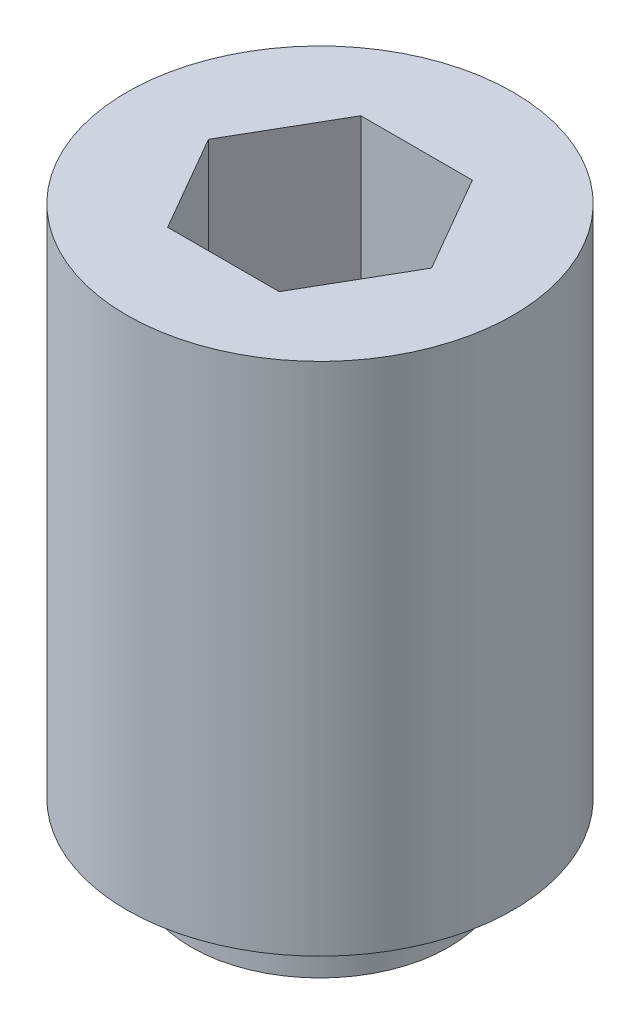
ISO-10303-21;
HEADER;
FILE_DESCRIPTION(('STEP AP214'),'2;1');
FILE_NAME('part.step','',(''),(''),'','','');
FILE_SCHEMA(('AUTOMOTIVE_DESIGN { 1 0 10303 214 1 1 1 1 }'));
ENDSEC;
DATA;
#1=APPLICATION_CONTEXT('core data for automotive mechanical design processes');
#2=APPLICATION_PROTOCOL_DEFINITION('international standard','automotive_design',2000,#1);
#3=PRODUCT_CONTEXT('',#1,'mechanical');
#4=PRODUCT('Part','Part','',(#3));
#5=PRODUCT_RELATED_PRODUCT_CATEGORY('part','',(#4));
#6=PRODUCT_DEFINITION_FORMATION('','',#4);
#7=PRODUCT_DEFINITION_CONTEXT('part definition',#1,'design');
#8=PRODUCT_DEFINITION('design','',#6,#7);
#9=PRODUCT_DEFINITION_SHAPE('','',#8);
#10=(LENGTH_UNIT() NAMED_UNIT(*) SI_UNIT(.MILLI.,.METRE.));
#11=(NAMED_UNIT(*) PLANE_ANGLE_UNIT() SI_UNIT($,.RADIAN.));
#12=(NAMED_UNIT(*) SI_UNIT($,.STERADIAN.) SOLID_ANGLE_UNIT());
#13=UNCERTAINTY_MEASURE_WITH_UNIT(LENGTH_MEASURE(1.E-05),#10,'distance_accuracy_value','');
#14=(GEOMETRIC_REPRESENTATION_CONTEXT(3) GLOBAL_UNCERTAINTY_ASSIGNED_CONTEXT((#13)) GLOBAL_UNIT_ASSIGNED_CONTEXT((#10,
#11,#12)) REPRESENTATION_CONTEXT('',''));
#15=CARTESIAN_POINT('',(0.,0.,0.));
#16=DIRECTION('',(0.,0.,1.));
#17=DIRECTION('',(1.,0.,0.));
#18=AXIS2_PLACEMENT_3D('',#15,#16,#17);
#19=CARTESIAN_POINT('',(0.,-9.,0.));
#20=DIRECTION('',(0.,1.,0.));
#21=DIRECTION('',(0.,0.,1.));
#22=AXIS2_PLACEMENT_3D('',#19,#20,#21);
#23=CYLINDRICAL_SURFACE('',#22,2.);
#24=CARTESIAN_POINT('',(0.,-9.,0.));
#25=DIRECTION('',(0.,-1.,0.));
#26=DIRECTION('',(0.,0.,-1.));
#27=AXIS2_PLACEMENT_3D('',#24,#25,#26);
#28=CIRCLE('',#27,2.);
#29=CARTESIAN_POINT('',(0.,-9.,-2.));
#30=VERTEX_POINT('',#29);
#31=EDGE_CURVE('E11',#30,#30,#28,.T.);
#32=ORIENTED_EDGE('',*,*,#31,.F.);
#33=EDGE_LOOP('',(#32));
#34=FACE_BOUND('',#33,.T.);
#35=CARTESIAN_POINT('',(0.,-8.,0.));
#36=DIRECTION('',(0.,-1.,0.));
#37=DIRECTION('',(0.,0.,-1.));
#38=AXIS2_PLACEMENT_3D('',#35,#36,#37);
#39=CIRCLE('',#38,2.);
#40=CARTESIAN_POINT('',(0.,-8.,-2.));
#41=VERTEX_POINT('',#40);
#42=EDGE_CURVE('E47',#41,#41,#39,.T.);
#43=ORIENTED_EDGE('',*,*,#42,.T.);
#44=EDGE_LOOP('',(#43));
#45=FACE_BOUND('',#44,.T.);
#46=ADVANCED_FACE('F44',(#34,#45),#23,.T.);
#47=CARTESIAN_POINT('',(0.,-9.,0.));
#48=DIRECTION('',(0.,-1.,0.));
#49=DIRECTION('',(0.,0.,-1.));
#50=AXIS2_PLACEMENT_3D('',#47,#48,#49);
#51=PLANE('',#50);
#52=ORIENTED_EDGE('',*,*,#31,.T.);
#53=EDGE_LOOP('',(#52));
#54=FACE_BOUND('',#53,.T.);
#55=ADVANCED_FACE('F59',(#54),#51,.T.);
#56=CARTESIAN_POINT('',(0.,-8.,0.));
#57=DIRECTION('',(0.,-1.,0.));
#58=DIRECTION('',(0.,0.,-1.));
#59=AXIS2_PLACEMENT_3D('',#56,#57,#58);
#60=PLANE('',#59);
#61=ORIENTED_EDGE('',*,*,#42,.F.);
#62=EDGE_LOOP('',(#61));
#63=FACE_BOUND('',#62,.T.);
#64=ADVANCED_FACE('F57',(#63),#60,.F.);
#65=CLOSED_SHELL('',(#46,#55,#64));
#66=MANIFOLD_SOLID_BREP('B2',#65);
#67=CARTESIAN_POINT('',(0.,-8.,0.));
#68=DIRECTION('',(0.,1.,0.));
#69=DIRECTION('',(0.,0.,1.));
#70=AXIS2_PLACEMENT_3D('',#67,#68,#69);
#71=PLANE('',#70);
#72=CARTESIAN_POINT('',(0.,-7.99999999999999,0.));
#73=DIRECTION('',(0.,1.,0.));
#74=DIRECTION('',(0.,0.,1.));
#75=AXIS2_PLACEMENT_3D('',#72,#73,#74);
#76=CIRCLE('',#75,3.00000000000001);
#77=CARTESIAN_POINT('',(0.,-7.99999999999999,3.00000000000001));
#78=VERTEX_POINT('',#77);
#79=EDGE_CURVE('E42',#78,#78,#76,.T.);
#80=ORIENTED_EDGE('',*,*,#79,.F.);
#81=EDGE_LOOP('',(#80));
#82=FACE_BOUND('',#81,.T.);
#83=ADVANCED_FACE('F84',(#82),#71,.F.);
#84=CARTESIAN_POINT('',(0.,61.6916426261037,0.));
#85=DIRECTION('',(0.,1.,0.));
#86=DIRECTION('',(0.,0.,1.));
#87=AXIS2_PLACEMENT_3D('',#84,#85,#86);
#88=CYLINDRICAL_SURFACE('',#87,3.00000000000001);
#89=CARTESIAN_POINT('',(0.,0.,0.));
#90=DIRECTION('',(0.,1.,0.));
#91=DIRECTION('',(0.,0.,1.));
#92=AXIS2_PLACEMENT_3D('',#89,#90,#91);
#93=CIRCLE('',#92,3.00000000000001);
#94=CARTESIAN_POINT('',(0.,0.,3.00000000000001));
#95=VERTEX_POINT('',#94);
#96=EDGE_CURVE('E91',#95,#95,#93,.T.);
#97=ORIENTED_EDGE('',*,*,#96,.F.);
#98=EDGE_LOOP('',(#97));
#99=FACE_BOUND('',#98,.T.);
#100=ORIENTED_EDGE('',*,*,#79,.T.);
#101=EDGE_LOOP('',(#100));
#102=FACE_BOUND('',#101,.T.);
#103=ADVANCED_FACE('F194',(#99,#102),#88,.T.);
#104=CARTESIAN_POINT('',(3.00000000000001,0.,0.));
#105=DIRECTION('',(0.,-1.,0.));
#106=DIRECTION('',(0.,0.,-1.));
#107=AXIS2_PLACEMENT_3D('',#104,#105,#106);
#108=PLANE('',#107);
#109=DIRECTION('',(-1.,0.,0.));
#110=VECTOR('',#109,1.);
#111=CARTESIAN_POINT('',(0.866025403784438,0.,-1.5));
#112=LINE('',#111,#110);
#113=CARTESIAN_POINT('',(0.866025403784438,0.,-1.5));
#114=VERTEX_POINT('',#113);
#115=CARTESIAN_POINT('',(-0.866025403784439,0.,-1.5));
#116=VERTEX_POINT('',#115);
#117=EDGE_CURVE('E172',#114,#116,#112,.T.);
#118=ORIENTED_EDGE('',*,*,#117,.F.);
#119=DIRECTION('',(-0.5,0.,-0.866025403784439));
#120=VECTOR('',#119,1.);
#121=CARTESIAN_POINT('',(1.73205080756888,0.,0.));
#122=LINE('',#121,#120);
#123=CARTESIAN_POINT('',(1.73205080756888,0.,0.));
#124=VERTEX_POINT('',#123);
#125=EDGE_CURVE('E98',#124,#114,#122,.T.);
#126=ORIENTED_EDGE('',*,*,#125,.F.);
#127=DIRECTION('',(0.5,0.,-0.866025403784439));
#128=VECTOR('',#127,1.);
#129=CARTESIAN_POINT('',(0.866025403784438,0.,1.5));
#130=LINE('',#129,#128);
#131=CARTESIAN_POINT('',(0.866025403784438,0.,1.5));
#132=VERTEX_POINT('',#131);
#133=EDGE_CURVE('E181',#132,#124,#130,.T.);
#134=ORIENTED_EDGE('',*,*,#133,.F.);
#135=DIRECTION('',(1.,0.,0.));
#136=VECTOR('',#135,1.);
#137=CARTESIAN_POINT('',(-0.866025403784439,0.,1.5));
#138=LINE('',#137,#136);
#139=CARTESIAN_POINT('',(-0.866025403784439,0.,1.5));
#140=VERTEX_POINT('',#139);
#141=EDGE_CURVE('E179',#140,#132,#138,.T.);
#142=ORIENTED_EDGE('',*,*,#141,.F.);
#143=DIRECTION('',(0.5,0.,0.866025403784438));
#144=VECTOR('',#143,1.);
#145=CARTESIAN_POINT('',(-1.73205080756888,0.,0.));
#146=LINE('',#145,#144);
#147=CARTESIAN_POINT('',(-1.73205080756888,0.,0.));
#148=VERTEX_POINT('',#147);
#149=EDGE_CURVE('E146',#148,#140,#146,.T.);
#150=ORIENTED_EDGE('',*,*,#149,.F.);
#151=DIRECTION('',(-0.5,0.,0.866025403784439));
#152=VECTOR('',#151,1.);
#153=CARTESIAN_POINT('',(-0.866025403784439,0.,-1.5));
#154=LINE('',#153,#152);
#155=EDGE_CURVE('E175',#116,#148,#154,.T.);
#156=ORIENTED_EDGE('',*,*,#155,.F.);
#157=EDGE_LOOP('',(#118,#126,#134,#142,#150,#156));
#158=FACE_BOUND('',#157,.T.);
#159=ORIENTED_EDGE('',*,*,#96,.T.);
#160=EDGE_LOOP('',(#159));
#161=FACE_BOUND('',#160,.T.);
#162=ADVANCED_FACE('F192',(#158,#161),#108,.F.);
#163=CARTESIAN_POINT('',(1.73205080756888,-3.5,0.));
#164=DIRECTION('',(0.866025403784439,0.,-0.5));
#165=DIRECTION('',(-0.5,0.,-0.866025403784439));
#166=AXIS2_PLACEMENT_3D('',#163,#164,#165);
#167=PLANE('',#166);
#168=ORIENTED_EDGE('',*,*,#125,.T.);
#169=DIRECTION('',(0.,1.,0.));
#170=VECTOR('',#169,1.);
#171=CARTESIAN_POINT('',(0.866025403784438,-3.5,-1.5));
#172=LINE('',#171,#170);
#173=CARTESIAN_POINT('',(0.866025403784438,-3.5,-1.5));
#174=VERTEX_POINT('',#173);
#175=EDGE_CURVE('E128',#174,#114,#172,.T.);
#176=ORIENTED_EDGE('',*,*,#175,.F.);
#177=DIRECTION('',(-0.5,0.,-0.866025403784439));
#178=VECTOR('',#177,1.);
#179=CARTESIAN_POINT('',(1.73205080756888,-3.5,0.));
#180=LINE('',#179,#178);
#181=CARTESIAN_POINT('',(1.73205080756888,-3.5,0.));
#182=VERTEX_POINT('',#181);
#183=EDGE_CURVE('E183',#182,#174,#180,.T.);
#184=ORIENTED_EDGE('',*,*,#183,.F.);
#185=DIRECTION('',(0.,1.,0.));
#186=VECTOR('',#185,1.);
#187=CARTESIAN_POINT('',(1.73205080756888,-3.5,0.));
#188=LINE('',#187,#186);
#189=EDGE_CURVE('E106',#182,#124,#188,.T.);
#190=ORIENTED_EDGE('',*,*,#189,.T.);
#191=EDGE_LOOP('',(#168,#176,#184,#190));
#192=FACE_BOUND('',#191,.T.);
#193=ADVANCED_FACE('F213',(#192),#167,.F.);
#194=CARTESIAN_POINT('',(0.866025403784438,-3.5,1.5));
#195=DIRECTION('',(0.866025403784439,0.,0.5));
#196=DIRECTION('',(0.5,0.,-0.866025403784439));
#197=AXIS2_PLACEMENT_3D('',#194,#195,#196);
#198=PLANE('',#197);
#199=ORIENTED_EDGE('',*,*,#133,.T.);
#200=ORIENTED_EDGE('',*,*,#189,.F.);
#201=DIRECTION('',(0.5,0.,-0.866025403784439));
#202=VECTOR('',#201,1.);
#203=CARTESIAN_POINT('',(0.866025403784438,-3.5,1.5));
#204=LINE('',#203,#202);
#205=CARTESIAN_POINT('',(0.866025403784438,-3.5,1.5));
#206=VERTEX_POINT('',#205);
#207=EDGE_CURVE('E158',#206,#182,#204,.T.);
#208=ORIENTED_EDGE('',*,*,#207,.F.);
#209=DIRECTION('',(0.,1.,0.));
#210=VECTOR('',#209,1.);
#211=CARTESIAN_POINT('',(0.866025403784438,-3.5,1.5));
#212=LINE('',#211,#210);
#213=EDGE_CURVE('E150',#206,#132,#212,.T.);
#214=ORIENTED_EDGE('',*,*,#213,.T.);
#215=EDGE_LOOP('',(#199,#200,#208,#214));
#216=FACE_BOUND('',#215,.T.);
#217=ADVANCED_FACE('F221',(#216),#198,.F.);
#218=CARTESIAN_POINT('',(-0.866025403784439,-3.5,1.5));
#219=DIRECTION('',(0.,0.,1.));
#220=DIRECTION('',(1.,0.,0.));
#221=AXIS2_PLACEMENT_3D('',#218,#219,#220);
#222=PLANE('',#221);
#223=ORIENTED_EDGE('',*,*,#141,.T.);
#224=ORIENTED_EDGE('',*,*,#213,.F.);
#225=DIRECTION('',(1.,0.,0.));
#226=VECTOR('',#225,1.);
#227=CARTESIAN_POINT('',(-0.866025403784439,-3.5,1.5));
#228=LINE('',#227,#226);
#229=CARTESIAN_POINT('',(-0.866025403784439,-3.5,1.5));
#230=VERTEX_POINT('',#229);
#231=EDGE_CURVE('E154',#230,#206,#228,.T.);
#232=ORIENTED_EDGE('',*,*,#231,.F.);
#233=DIRECTION('',(0.,1.,0.));
#234=VECTOR('',#233,1.);
#235=CARTESIAN_POINT('',(-0.866025403784439,-3.5,1.5));
#236=LINE('',#235,#234);
#237=EDGE_CURVE('E139',#230,#140,#236,.T.);
#238=ORIENTED_EDGE('',*,*,#237,.T.);
#239=EDGE_LOOP('',(#223,#224,#232,#238));
#240=FACE_BOUND('',#239,.T.);
#241=ADVANCED_FACE('F155',(#240),#222,.F.);
#242=CARTESIAN_POINT('',(-1.73205080756888,-3.5,0.));
#243=DIRECTION('',(-0.866025403784438,0.,0.5));
#244=DIRECTION('',(0.5,0.,0.866025403784439));
#245=AXIS2_PLACEMENT_3D('',#242,#243,#244);
#246=PLANE('',#245);
#247=ORIENTED_EDGE('',*,*,#149,.T.);
#248=ORIENTED_EDGE('',*,*,#237,.F.);
#249=DIRECTION('',(0.5,0.,0.866025403784438));
#250=VECTOR('',#249,1.);
#251=CARTESIAN_POINT('',(-1.73205080756888,-3.5,0.));
#252=LINE('',#251,#250);
#253=CARTESIAN_POINT('',(-1.73205080756888,-3.5,0.));
#254=VERTEX_POINT('',#253);
#255=EDGE_CURVE('E143',#254,#230,#252,.T.);
#256=ORIENTED_EDGE('',*,*,#255,.F.);
#257=DIRECTION('',(0.,1.,0.));
#258=VECTOR('',#257,1.);
#259=CARTESIAN_POINT('',(-1.73205080756888,-3.5,0.));
#260=LINE('',#259,#258);
#261=EDGE_CURVE('E151',#254,#148,#260,.T.);
#262=ORIENTED_EDGE('',*,*,#261,.T.);
#263=EDGE_LOOP('',(#247,#248,#256,#262));
#264=FACE_BOUND('',#263,.T.);
#265=ADVANCED_FACE('F141',(#264),#246,.F.);
#266=CARTESIAN_POINT('',(-0.866025403784439,-3.5,-1.5));
#267=DIRECTION('',(-0.866025403784439,0.,-0.5));
#268=DIRECTION('',(-0.5,0.,0.866025403784439));
#269=AXIS2_PLACEMENT_3D('',#266,#267,#268);
#270=PLANE('',#269);
#271=ORIENTED_EDGE('',*,*,#155,.T.);
#272=ORIENTED_EDGE('',*,*,#261,.F.);
#273=DIRECTION('',(-0.5,0.,0.866025403784439));
#274=VECTOR('',#273,1.);
#275=CARTESIAN_POINT('',(-0.866025403784439,-3.5,-1.5));
#276=LINE('',#275,#274);
#277=CARTESIAN_POINT('',(-0.866025403784439,-3.5,-1.5));
#278=VERTEX_POINT('',#277);
#279=EDGE_CURVE('E164',#278,#254,#276,.T.);
#280=ORIENTED_EDGE('',*,*,#279,.F.);
#281=DIRECTION('',(0.,1.,0.));
#282=VECTOR('',#281,1.);
#283=CARTESIAN_POINT('',(-0.866025403784439,-3.5,-1.5));
#284=LINE('',#283,#282);
#285=EDGE_CURVE('E187',#278,#116,#284,.T.);
#286=ORIENTED_EDGE('',*,*,#285,.T.);
#287=EDGE_LOOP('',(#271,#272,#280,#286));
#288=FACE_BOUND('',#287,.T.);
#289=ADVANCED_FACE('F240',(#288),#270,.F.);
#290=CARTESIAN_POINT('',(0.866025403784438,-3.5,-1.5));
#291=DIRECTION('',(0.,0.,-1.));
#292=DIRECTION('',(-1.,0.,0.));
#293=AXIS2_PLACEMENT_3D('',#290,#291,#292);
#294=PLANE('',#293);
#295=ORIENTED_EDGE('',*,*,#117,.T.);
#296=ORIENTED_EDGE('',*,*,#285,.F.);
#297=DIRECTION('',(-1.,0.,0.));
#298=VECTOR('',#297,1.);
#299=CARTESIAN_POINT('',(0.866025403784438,-3.5,-1.5));
#300=LINE('',#299,#298);
#301=EDGE_CURVE('E166',#174,#278,#300,.T.);
#302=ORIENTED_EDGE('',*,*,#301,.F.);
#303=ORIENTED_EDGE('',*,*,#175,.T.);
#304=EDGE_LOOP('',(#295,#296,#302,#303));
#305=FACE_BOUND('',#304,.T.);
#306=ADVANCED_FACE('F247',(#305),#294,.F.);
#307=CARTESIAN_POINT('',(0.866025403784438,-3.5,-1.5));
#308=DIRECTION('',(0.,1.,0.));
#309=DIRECTION('',(0.,0.,1.));
#310=AXIS2_PLACEMENT_3D('',#307,#308,#309);
#311=PLANE('',#310);
#312=ORIENTED_EDGE('',*,*,#183,.T.);
#313=ORIENTED_EDGE('',*,*,#301,.T.);
#314=ORIENTED_EDGE('',*,*,#279,.T.);
#315=ORIENTED_EDGE('',*,*,#255,.T.);
#316=ORIENTED_EDGE('',*,*,#231,.T.);
#317=ORIENTED_EDGE('',*,*,#207,.T.);
#318=EDGE_LOOP('',(#312,#313,#314,#315,#316,#317));
#319=FACE_BOUND('',#318,.T.);
#320=ADVANCED_FACE('F161',(#319),#311,.T.);
#321=CLOSED_SHELL('',(#83,#103,#162,#193,#217,#241,#265,#289,#306,#320));
#322=MANIFOLD_SOLID_BREP('B6',#321);
#323=ADVANCED_BREP_SHAPE_REPRESENTATION('',(#18,#66,#322),#14);
#324=SHAPE_DEFINITION_REPRESENTATION(#9,#323);
ENDSEC;
END-ISO-10303-21;
